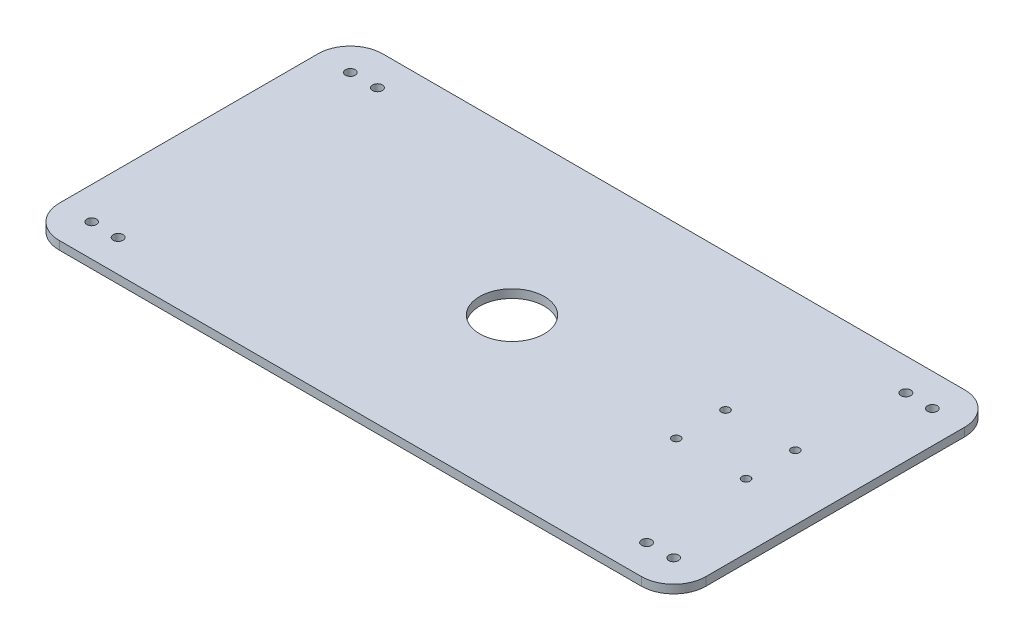
ISO-10303-21;
HEADER;
FILE_DESCRIPTION(('STEP AP214'),'2;1');
FILE_NAME('part.step','',(''),(''),'','','');
FILE_SCHEMA(('AUTOMOTIVE_DESIGN { 1 0 10303 214 1 1 1 1 }'));
ENDSEC;
DATA;
#1=APPLICATION_CONTEXT('core data for automotive mechanical design processes');
#2=APPLICATION_PROTOCOL_DEFINITION('international standard','automotive_design',2000,#1);
#3=PRODUCT_CONTEXT('',#1,'mechanical');
#4=PRODUCT('Part','Part','',(#3));
#5=PRODUCT_RELATED_PRODUCT_CATEGORY('part','',(#4));
#6=PRODUCT_DEFINITION_FORMATION('','',#4);
#7=PRODUCT_DEFINITION_CONTEXT('part definition',#1,'design');
#8=PRODUCT_DEFINITION('design','',#6,#7);
#9=PRODUCT_DEFINITION_SHAPE('','',#8);
#10=(LENGTH_UNIT() NAMED_UNIT(*) SI_UNIT(.MILLI.,.METRE.));
#11=(NAMED_UNIT(*) PLANE_ANGLE_UNIT() SI_UNIT($,.RADIAN.));
#12=(NAMED_UNIT(*) SI_UNIT($,.STERADIAN.) SOLID_ANGLE_UNIT());
#13=UNCERTAINTY_MEASURE_WITH_UNIT(LENGTH_MEASURE(1.E-05),#10,'distance_accuracy_value','');
#14=(GEOMETRIC_REPRESENTATION_CONTEXT(3) GLOBAL_UNCERTAINTY_ASSIGNED_CONTEXT((#13)) GLOBAL_UNIT_ASSIGNED_CONTEXT((#10,
#11,#12)) REPRESENTATION_CONTEXT('',''));
#15=CARTESIAN_POINT('',(0.,0.,0.));
#16=DIRECTION('',(0.,0.,1.));
#17=DIRECTION('',(1.,0.,0.));
#18=AXIS2_PLACEMENT_3D('',#15,#16,#17);
#19=CARTESIAN_POINT('',(0.,2.6,0.));
#20=DIRECTION('',(1.,0.,0.));
#21=DIRECTION('',(0.,0.,-1.));
#22=AXIS2_PLACEMENT_3D('',#19,#20,#21);
#23=PLANE('',#22);
#24=DIRECTION('',(0.,0.,1.));
#25=VECTOR('',#24,1.);
#26=CARTESIAN_POINT('',(0.,2.6,0.));
#27=LINE('',#26,#25);
#28=CARTESIAN_POINT('',(0.,2.6,10.));
#29=VERTEX_POINT('',#28);
#30=CARTESIAN_POINT('',(0.,2.6,90.));
#31=VERTEX_POINT('',#30);
#32=EDGE_CURVE('E120',#29,#31,#27,.T.);
#33=ORIENTED_EDGE('',*,*,#32,.F.);
#34=DIRECTION('',(0.,-1.,0.));
#35=VECTOR('',#34,1.);
#36=CARTESIAN_POINT('',(0.,0.,10.));
#37=LINE('',#36,#35);
#38=CARTESIAN_POINT('',(0.,0.,10.));
#39=VERTEX_POINT('',#38);
#40=EDGE_CURVE('E105',#29,#39,#37,.T.);
#41=ORIENTED_EDGE('',*,*,#40,.T.);
#42=DIRECTION('',(0.,0.,1.));
#43=VECTOR('',#42,1.);
#44=CARTESIAN_POINT('',(0.,0.,0.));
#45=LINE('',#44,#43);
#46=CARTESIAN_POINT('',(0.,0.,90.));
#47=VERTEX_POINT('',#46);
#48=EDGE_CURVE('E117',#39,#47,#45,.T.);
#49=ORIENTED_EDGE('',*,*,#48,.T.);
#50=DIRECTION('',(0.,-1.,0.));
#51=VECTOR('',#50,1.);
#52=CARTESIAN_POINT('',(0.,2.6,90.));
#53=LINE('',#52,#51);
#54=EDGE_CURVE('E122',#47,#31,#53,.F.);
#55=ORIENTED_EDGE('',*,*,#54,.T.);
#56=EDGE_LOOP('',(#33,#41,#49,#55));
#57=FACE_BOUND('',#56,.T.);
#58=ADVANCED_FACE('F35',(#57),#23,.F.);
#59=CARTESIAN_POINT('',(0.,2.6,100.));
#60=DIRECTION('',(0.,0.,-1.));
#61=DIRECTION('',(-1.,0.,0.));
#62=AXIS2_PLACEMENT_3D('',#59,#60,#61);
#63=PLANE('',#62);
#64=DIRECTION('',(1.,0.,0.));
#65=VECTOR('',#64,1.);
#66=CARTESIAN_POINT('',(0.,2.6,100.));
#67=LINE('',#66,#65);
#68=CARTESIAN_POINT('',(10.,2.6,100.));
#69=VERTEX_POINT('',#68);
#70=CARTESIAN_POINT('',(190.,2.6,100.));
#71=VERTEX_POINT('',#70);
#72=EDGE_CURVE('E167',#69,#71,#67,.T.);
#73=ORIENTED_EDGE('',*,*,#72,.F.);
#74=DIRECTION('',(0.,-1.,0.));
#75=VECTOR('',#74,1.);
#76=CARTESIAN_POINT('',(10.,2.6,100.));
#77=LINE('',#76,#75);
#78=CARTESIAN_POINT('',(10.,0.,100.));
#79=VERTEX_POINT('',#78);
#80=EDGE_CURVE('E160',#69,#79,#77,.T.);
#81=ORIENTED_EDGE('',*,*,#80,.T.);
#82=DIRECTION('',(1.,0.,0.));
#83=VECTOR('',#82,1.);
#84=CARTESIAN_POINT('',(0.,0.,100.));
#85=LINE('',#84,#83);
#86=CARTESIAN_POINT('',(190.,0.,100.));
#87=VERTEX_POINT('',#86);
#88=EDGE_CURVE('E126',#79,#87,#85,.T.);
#89=ORIENTED_EDGE('',*,*,#88,.T.);
#90=DIRECTION('',(0.,-1.,0.));
#91=VECTOR('',#90,1.);
#92=CARTESIAN_POINT('',(190.,2.6,100.));
#93=LINE('',#92,#91);
#94=EDGE_CURVE('E158',#87,#71,#93,.F.);
#95=ORIENTED_EDGE('',*,*,#94,.T.);
#96=EDGE_LOOP('',(#73,#81,#89,#95));
#97=FACE_BOUND('',#96,.T.);
#98=ADVANCED_FACE('F165',(#97),#63,.F.);
#99=CARTESIAN_POINT('',(200.,2.6,0.));
#100=DIRECTION('',(1.,0.,0.));
#101=DIRECTION('',(0.,0.,-1.));
#102=AXIS2_PLACEMENT_3D('',#99,#100,#101);
#103=PLANE('',#102);
#104=DIRECTION('',(0.,0.,1.));
#105=VECTOR('',#104,1.);
#106=CARTESIAN_POINT('',(200.,2.6,0.));
#107=LINE('',#106,#105);
#108=CARTESIAN_POINT('',(200.,2.6,10.));
#109=VERTEX_POINT('',#108);
#110=CARTESIAN_POINT('',(200.,2.6,90.));
#111=VERTEX_POINT('',#110);
#112=EDGE_CURVE('E174',#109,#111,#107,.T.);
#113=ORIENTED_EDGE('',*,*,#112,.T.);
#114=DIRECTION('',(0.,-1.,0.));
#115=VECTOR('',#114,1.);
#116=CARTESIAN_POINT('',(200.,0.,90.));
#117=LINE('',#116,#115);
#118=CARTESIAN_POINT('',(200.,0.,90.));
#119=VERTEX_POINT('',#118);
#120=EDGE_CURVE('E11',#111,#119,#117,.T.);
#121=ORIENTED_EDGE('',*,*,#120,.T.);
#122=DIRECTION('',(0.,0.,1.));
#123=VECTOR('',#122,1.);
#124=CARTESIAN_POINT('',(200.,0.,0.));
#125=LINE('',#124,#123);
#126=CARTESIAN_POINT('',(200.,0.,10.));
#127=VERTEX_POINT('',#126);
#128=EDGE_CURVE('E130',#127,#119,#125,.T.);
#129=ORIENTED_EDGE('',*,*,#128,.F.);
#130=DIRECTION('',(0.,-1.,0.));
#131=VECTOR('',#130,1.);
#132=CARTESIAN_POINT('',(200.,2.6,10.));
#133=LINE('',#132,#131);
#134=EDGE_CURVE('E43',#127,#109,#133,.F.);
#135=ORIENTED_EDGE('',*,*,#134,.T.);
#136=EDGE_LOOP('',(#113,#121,#129,#135));
#137=FACE_BOUND('',#136,.T.);
#138=ADVANCED_FACE('F173',(#137),#103,.T.);
#139=CARTESIAN_POINT('',(0.,2.6,0.));
#140=DIRECTION('',(0.,0.,-1.));
#141=DIRECTION('',(-1.,0.,0.));
#142=AXIS2_PLACEMENT_3D('',#139,#140,#141);
#143=PLANE('',#142);
#144=DIRECTION('',(1.,0.,0.));
#145=VECTOR('',#144,1.);
#146=CARTESIAN_POINT('',(0.,0.,0.));
#147=LINE('',#146,#145);
#148=CARTESIAN_POINT('',(10.,0.,0.));
#149=VERTEX_POINT('',#148);
#150=CARTESIAN_POINT('',(190.,0.,0.));
#151=VERTEX_POINT('',#150);
#152=EDGE_CURVE('E141',#149,#151,#147,.T.);
#153=ORIENTED_EDGE('',*,*,#152,.F.);
#154=DIRECTION('',(0.,-1.,0.));
#155=VECTOR('',#154,1.);
#156=CARTESIAN_POINT('',(10.,2.6,0.));
#157=LINE('',#156,#155);
#158=CARTESIAN_POINT('',(10.,2.6,0.));
#159=VERTEX_POINT('',#158);
#160=EDGE_CURVE('E106',#149,#159,#157,.F.);
#161=ORIENTED_EDGE('',*,*,#160,.T.);
#162=DIRECTION('',(1.,0.,0.));
#163=VECTOR('',#162,1.);
#164=CARTESIAN_POINT('',(0.,2.6,0.));
#165=LINE('',#164,#163);
#166=CARTESIAN_POINT('',(190.,2.6,0.));
#167=VERTEX_POINT('',#166);
#168=EDGE_CURVE('E136',#159,#167,#165,.T.);
#169=ORIENTED_EDGE('',*,*,#168,.T.);
#170=DIRECTION('',(0.,-1.,0.));
#171=VECTOR('',#170,1.);
#172=CARTESIAN_POINT('',(190.,2.6,0.));
#173=LINE('',#172,#171);
#174=EDGE_CURVE('E111',#167,#151,#173,.T.);
#175=ORIENTED_EDGE('',*,*,#174,.T.);
#176=EDGE_LOOP('',(#153,#161,#169,#175));
#177=FACE_BOUND('',#176,.T.);
#178=ADVANCED_FACE('F431',(#177),#143,.T.);
#179=CARTESIAN_POINT('',(0.,2.6,0.));
#180=DIRECTION('',(0.,1.,0.));
#181=DIRECTION('',(0.,0.,1.));
#182=AXIS2_PLACEMENT_3D('',#179,#180,#181);
#183=PLANE('',#182);
#184=CARTESIAN_POINT('',(18.288,2.6,90.094));
#185=DIRECTION('',(0.,-1.,0.));
#186=DIRECTION('',(0.,0.,-1.));
#187=AXIS2_PLACEMENT_3D('',#184,#185,#186);
#188=CIRCLE('',#187,1.524);
#189=CARTESIAN_POINT('',(18.288,2.6,88.57));
#190=VERTEX_POINT('',#189);
#191=EDGE_CURVE('E249',#190,#190,#188,.T.);
#192=ORIENTED_EDGE('',*,*,#191,.T.);
#193=EDGE_LOOP('',(#192));
#194=FACE_BOUND('',#193,.T.);
#195=CARTESIAN_POINT('',(181.712,2.6,90.094));
#196=DIRECTION('',(0.,1.,0.));
#197=DIRECTION('',(0.,0.,-1.));
#198=AXIS2_PLACEMENT_3D('',#195,#196,#197);
#199=CIRCLE('',#198,1.524);
#200=CARTESIAN_POINT('',(181.712,2.6,88.57));
#201=VERTEX_POINT('',#200);
#202=EDGE_CURVE('E243',#201,#201,#199,.T.);
#203=ORIENTED_EDGE('',*,*,#202,.F.);
#204=EDGE_LOOP('',(#203));
#205=FACE_BOUND('',#204,.T.);
#206=CARTESIAN_POINT('',(181.712,2.6,9.90599999999999));
#207=DIRECTION('',(0.,-1.,0.));
#208=DIRECTION('',(0.,0.,1.));
#209=AXIS2_PLACEMENT_3D('',#206,#207,#208);
#210=CIRCLE('',#209,1.524);
#211=CARTESIAN_POINT('',(181.712,2.6,11.43));
#212=VERTEX_POINT('',#211);
#213=EDGE_CURVE('E237',#212,#212,#210,.T.);
#214=ORIENTED_EDGE('',*,*,#213,.T.);
#215=EDGE_LOOP('',(#214));
#216=FACE_BOUND('',#215,.T.);
#217=CARTESIAN_POINT('',(18.288,2.6,9.906));
#218=DIRECTION('',(0.,1.,0.));
#219=DIRECTION('',(0.,0.,1.));
#220=AXIS2_PLACEMENT_3D('',#217,#218,#219);
#221=CIRCLE('',#220,1.524);
#222=CARTESIAN_POINT('',(18.288,2.6,11.43));
#223=VERTEX_POINT('',#222);
#224=EDGE_CURVE('E231',#223,#223,#221,.T.);
#225=ORIENTED_EDGE('',*,*,#224,.F.);
#226=EDGE_LOOP('',(#225));
#227=FACE_BOUND('',#226,.T.);
#228=CARTESIAN_POINT('',(180.,2.6,42.38));
#229=DIRECTION('',(0.,1.,0.));
#230=DIRECTION('',(0.,0.,1.));
#231=AXIS2_PLACEMENT_3D('',#228,#229,#230);
#232=CIRCLE('',#231,1.27);
#233=CARTESIAN_POINT('',(180.,2.6,43.65));
#234=VERTEX_POINT('',#233);
#235=EDGE_CURVE('E226',#234,#234,#232,.T.);
#236=ORIENTED_EDGE('',*,*,#235,.F.);
#237=EDGE_LOOP('',(#236));
#238=FACE_BOUND('',#237,.T.);
#239=CARTESIAN_POINT('',(158.41,2.6,57.62));
#240=DIRECTION('',(0.,1.,0.));
#241=DIRECTION('',(0.,0.,1.));
#242=AXIS2_PLACEMENT_3D('',#239,#240,#241);
#243=CIRCLE('',#242,1.27);
#244=CARTESIAN_POINT('',(158.41,2.6,58.89));
#245=VERTEX_POINT('',#244);
#246=EDGE_CURVE('E220',#245,#245,#243,.T.);
#247=ORIENTED_EDGE('',*,*,#246,.F.);
#248=EDGE_LOOP('',(#247));
#249=FACE_BOUND('',#248,.T.);
#250=CARTESIAN_POINT('',(180.,2.6,57.62));
#251=DIRECTION('',(0.,1.,0.));
#252=DIRECTION('',(0.,0.,1.));
#253=AXIS2_PLACEMENT_3D('',#250,#251,#252);
#254=CIRCLE('',#253,1.27);
#255=CARTESIAN_POINT('',(180.,2.6,58.89));
#256=VERTEX_POINT('',#255);
#257=EDGE_CURVE('E213',#256,#256,#254,.T.);
#258=ORIENTED_EDGE('',*,*,#257,.F.);
#259=EDGE_LOOP('',(#258));
#260=FACE_BOUND('',#259,.T.);
#261=CARTESIAN_POINT('',(158.41,2.6,42.38));
#262=DIRECTION('',(0.,1.,0.));
#263=DIRECTION('',(0.,0.,1.));
#264=AXIS2_PLACEMENT_3D('',#261,#262,#263);
#265=CIRCLE('',#264,1.27);
#266=CARTESIAN_POINT('',(158.41,2.6,43.65));
#267=VERTEX_POINT('',#266);
#268=EDGE_CURVE('E207',#267,#267,#265,.T.);
#269=ORIENTED_EDGE('',*,*,#268,.F.);
#270=EDGE_LOOP('',(#269));
#271=FACE_BOUND('',#270,.T.);
#272=CARTESIAN_POINT('',(100.,2.6,50.));
#273=DIRECTION('',(0.,-1.,0.));
#274=DIRECTION('',(0.,0.,-1.));
#275=AXIS2_PLACEMENT_3D('',#272,#273,#274);
#276=CIRCLE('',#275,9.99999999999999);
#277=CARTESIAN_POINT('',(100.,2.6,40.));
#278=VERTEX_POINT('',#277);
#279=EDGE_CURVE('E198',#278,#278,#276,.T.);
#280=ORIENTED_EDGE('',*,*,#279,.T.);
#281=EDGE_LOOP('',(#280));
#282=FACE_BOUND('',#281,.T.);
#283=CARTESIAN_POINT('',(190.,2.6,90.));
#284=DIRECTION('',(0.,1.,0.));
#285=DIRECTION('',(0.,0.,1.));
#286=AXIS2_PLACEMENT_3D('',#283,#284,#285);
#287=CIRCLE('',#286,1.5);
#288=CARTESIAN_POINT('',(190.,2.6,91.5));
#289=VERTEX_POINT('',#288);
#290=EDGE_CURVE('E192',#289,#289,#287,.T.);
#291=ORIENTED_EDGE('',*,*,#290,.F.);
#292=EDGE_LOOP('',(#291));
#293=FACE_BOUND('',#292,.T.);
#294=CARTESIAN_POINT('',(10.,2.6,90.));
#295=DIRECTION('',(0.,-1.,0.));
#296=DIRECTION('',(0.,0.,1.));
#297=AXIS2_PLACEMENT_3D('',#294,#295,#296);
#298=CIRCLE('',#297,1.5);
#299=CARTESIAN_POINT('',(10.,2.6,91.5));
#300=VERTEX_POINT('',#299);
#301=EDGE_CURVE('E186',#300,#300,#298,.T.);
#302=ORIENTED_EDGE('',*,*,#301,.T.);
#303=EDGE_LOOP('',(#302));
#304=FACE_BOUND('',#303,.T.);
#305=CARTESIAN_POINT('',(10.,2.6,10.));
#306=DIRECTION('',(0.,1.,0.));
#307=DIRECTION('',(0.,0.,-1.));
#308=AXIS2_PLACEMENT_3D('',#305,#306,#307);
#309=CIRCLE('',#308,1.5);
#310=CARTESIAN_POINT('',(10.,2.6,8.50000000000001));
#311=VERTEX_POINT('',#310);
#312=EDGE_CURVE('E181',#311,#311,#309,.T.);
#313=ORIENTED_EDGE('',*,*,#312,.F.);
#314=EDGE_LOOP('',(#313));
#315=FACE_BOUND('',#314,.T.);
#316=CARTESIAN_POINT('',(190.,2.6,10.));
#317=DIRECTION('',(0.,-1.,0.));
#318=DIRECTION('',(0.,0.,-1.));
#319=AXIS2_PLACEMENT_3D('',#316,#317,#318);
#320=CIRCLE('',#319,1.5);
#321=CARTESIAN_POINT('',(190.,2.6,8.5));
#322=VERTEX_POINT('',#321);
#323=EDGE_CURVE('E127',#322,#322,#320,.T.);
#324=ORIENTED_EDGE('',*,*,#323,.T.);
#325=EDGE_LOOP('',(#324));
#326=FACE_BOUND('',#325,.T.);
#327=ORIENTED_EDGE('',*,*,#168,.F.);
#328=CARTESIAN_POINT('',(10.,2.6,10.));
#329=DIRECTION('',(0.,1.,0.));
#330=DIRECTION('',(0.,0.,1.));
#331=AXIS2_PLACEMENT_3D('',#328,#329,#330);
#332=CIRCLE('',#331,10.);
#333=EDGE_CURVE('E156',#159,#29,#332,.T.);
#334=ORIENTED_EDGE('',*,*,#333,.T.);
#335=ORIENTED_EDGE('',*,*,#32,.T.);
#336=CARTESIAN_POINT('',(10.,2.6,90.));
#337=DIRECTION('',(0.,1.,0.));
#338=DIRECTION('',(0.,0.,1.));
#339=AXIS2_PLACEMENT_3D('',#336,#337,#338);
#340=CIRCLE('',#339,10.);
#341=EDGE_CURVE('E154',#31,#69,#340,.T.);
#342=ORIENTED_EDGE('',*,*,#341,.T.);
#343=ORIENTED_EDGE('',*,*,#72,.T.);
#344=CARTESIAN_POINT('',(190.,2.6,90.));
#345=DIRECTION('',(0.,1.,0.));
#346=DIRECTION('',(0.,0.,1.));
#347=AXIS2_PLACEMENT_3D('',#344,#345,#346);
#348=CIRCLE('',#347,10.);
#349=EDGE_CURVE('E50',#71,#111,#348,.T.);
#350=ORIENTED_EDGE('',*,*,#349,.T.);
#351=ORIENTED_EDGE('',*,*,#112,.F.);
#352=CARTESIAN_POINT('',(190.,2.6,10.));
#353=DIRECTION('',(0.,1.,0.));
#354=DIRECTION('',(0.,0.,1.));
#355=AXIS2_PLACEMENT_3D('',#352,#353,#354);
#356=CIRCLE('',#355,10.);
#357=EDGE_CURVE('E151',#109,#167,#356,.T.);
#358=ORIENTED_EDGE('',*,*,#357,.T.);
#359=EDGE_LOOP('',(#327,#334,#335,#342,#343,#350,#351,#358));
#360=FACE_BOUND('',#359,.T.);
#361=ADVANCED_FACE('F260',(#194,#205,#216,#227,#238,#249,#260,#271,#282,#293,#304,#315,#326,
#360),#183,.T.);
#362=CARTESIAN_POINT('',(0.,0.,0.));
#363=DIRECTION('',(0.,1.,0.));
#364=DIRECTION('',(0.,0.,1.));
#365=AXIS2_PLACEMENT_3D('',#362,#363,#364);
#366=PLANE('',#365);
#367=CARTESIAN_POINT('',(18.288,1.19999999954185E-07,90.094));
#368=DIRECTION('',(0.,-1.,0.));
#369=DIRECTION('',(0.,0.,-1.));
#370=AXIS2_PLACEMENT_3D('',#367,#368,#369);
#371=CIRCLE('',#370,1.524);
#372=CARTESIAN_POINT('',(18.288,1.19999999954185E-07,88.57));
#373=VERTEX_POINT('',#372);
#374=EDGE_CURVE('E246',#373,#373,#371,.T.);
#375=ORIENTED_EDGE('',*,*,#374,.F.);
#376=EDGE_LOOP('',(#375));
#377=FACE_BOUND('',#376,.T.);
#378=CARTESIAN_POINT('',(181.712,1.19999999954185E-07,90.094));
#379=DIRECTION('',(0.,1.,0.));
#380=DIRECTION('',(0.,0.,-1.));
#381=AXIS2_PLACEMENT_3D('',#378,#379,#380);
#382=CIRCLE('',#381,1.524);
#383=CARTESIAN_POINT('',(181.712,1.19999999954185E-07,88.57));
#384=VERTEX_POINT('',#383);
#385=EDGE_CURVE('E240',#384,#384,#382,.T.);
#386=ORIENTED_EDGE('',*,*,#385,.T.);
#387=EDGE_LOOP('',(#386));
#388=FACE_BOUND('',#387,.T.);
#389=CARTESIAN_POINT('',(181.712,1.19999999954185E-07,9.90599999999999));
#390=DIRECTION('',(0.,-1.,0.));
#391=DIRECTION('',(0.,0.,1.));
#392=AXIS2_PLACEMENT_3D('',#389,#390,#391);
#393=CIRCLE('',#392,1.524);
#394=CARTESIAN_POINT('',(181.712,1.19999999954185E-07,11.43));
#395=VERTEX_POINT('',#394);
#396=EDGE_CURVE('E234',#395,#395,#393,.T.);
#397=ORIENTED_EDGE('',*,*,#396,.F.);
#398=EDGE_LOOP('',(#397));
#399=FACE_BOUND('',#398,.T.);
#400=CARTESIAN_POINT('',(18.288,1.19999999954185E-07,9.906));
#401=DIRECTION('',(0.,1.,0.));
#402=DIRECTION('',(0.,0.,1.));
#403=AXIS2_PLACEMENT_3D('',#400,#401,#402);
#404=CIRCLE('',#403,1.524);
#405=CARTESIAN_POINT('',(18.288,1.19999999954185E-07,11.43));
#406=VERTEX_POINT('',#405);
#407=EDGE_CURVE('E217',#406,#406,#404,.T.);
#408=ORIENTED_EDGE('',*,*,#407,.T.);
#409=EDGE_LOOP('',(#408));
#410=FACE_BOUND('',#409,.T.);
#411=CARTESIAN_POINT('',(180.,0.,42.38));
#412=DIRECTION('',(0.,1.,0.));
#413=DIRECTION('',(0.,0.,1.));
#414=AXIS2_PLACEMENT_3D('',#411,#412,#413);
#415=CIRCLE('',#414,1.27);
#416=CARTESIAN_POINT('',(180.,0.,43.65));
#417=VERTEX_POINT('',#416);
#418=EDGE_CURVE('E210',#417,#417,#415,.T.);
#419=ORIENTED_EDGE('',*,*,#418,.T.);
#420=EDGE_LOOP('',(#419));
#421=FACE_BOUND('',#420,.T.);
#422=CARTESIAN_POINT('',(158.41,0.,57.62));
#423=DIRECTION('',(0.,1.,0.));
#424=DIRECTION('',(0.,0.,1.));
#425=AXIS2_PLACEMENT_3D('',#422,#423,#424);
#426=CIRCLE('',#425,1.27);
#427=CARTESIAN_POINT('',(158.41,0.,58.89));
#428=VERTEX_POINT('',#427);
#429=EDGE_CURVE('E223',#428,#428,#426,.T.);
#430=ORIENTED_EDGE('',*,*,#429,.T.);
#431=EDGE_LOOP('',(#430));
#432=FACE_BOUND('',#431,.T.);
#433=CARTESIAN_POINT('',(180.,0.,57.62));
#434=DIRECTION('',(0.,1.,0.));
#435=DIRECTION('',(0.,0.,1.));
#436=AXIS2_PLACEMENT_3D('',#433,#434,#435);
#437=CIRCLE('',#436,1.27);
#438=CARTESIAN_POINT('',(180.,0.,58.89));
#439=VERTEX_POINT('',#438);
#440=EDGE_CURVE('E216',#439,#439,#437,.T.);
#441=ORIENTED_EDGE('',*,*,#440,.T.);
#442=EDGE_LOOP('',(#441));
#443=FACE_BOUND('',#442,.T.);
#444=CARTESIAN_POINT('',(158.41,0.,42.38));
#445=DIRECTION('',(0.,1.,0.));
#446=DIRECTION('',(0.,0.,1.));
#447=AXIS2_PLACEMENT_3D('',#444,#445,#446);
#448=CIRCLE('',#447,1.27);
#449=CARTESIAN_POINT('',(158.41,0.,43.65));
#450=VERTEX_POINT('',#449);
#451=EDGE_CURVE('E204',#450,#450,#448,.T.);
#452=ORIENTED_EDGE('',*,*,#451,.T.);
#453=EDGE_LOOP('',(#452));
#454=FACE_BOUND('',#453,.T.);
#455=CARTESIAN_POINT('',(100.,0.,50.));
#456=DIRECTION('',(0.,-1.,0.));
#457=DIRECTION('',(0.,0.,-1.));
#458=AXIS2_PLACEMENT_3D('',#455,#456,#457);
#459=CIRCLE('',#458,9.99999999999999);
#460=CARTESIAN_POINT('',(100.,0.,40.));
#461=VERTEX_POINT('',#460);
#462=EDGE_CURVE('E201',#461,#461,#459,.T.);
#463=ORIENTED_EDGE('',*,*,#462,.F.);
#464=EDGE_LOOP('',(#463));
#465=FACE_BOUND('',#464,.T.);
#466=CARTESIAN_POINT('',(190.,0.,90.));
#467=DIRECTION('',(0.,1.,0.));
#468=DIRECTION('',(0.,0.,1.));
#469=AXIS2_PLACEMENT_3D('',#466,#467,#468);
#470=CIRCLE('',#469,1.5);
#471=CARTESIAN_POINT('',(190.,0.,91.5));
#472=VERTEX_POINT('',#471);
#473=EDGE_CURVE('E195',#472,#472,#470,.T.);
#474=ORIENTED_EDGE('',*,*,#473,.T.);
#475=EDGE_LOOP('',(#474));
#476=FACE_BOUND('',#475,.T.);
#477=CARTESIAN_POINT('',(10.,0.,90.));
#478=DIRECTION('',(0.,-1.,0.));
#479=DIRECTION('',(0.,0.,1.));
#480=AXIS2_PLACEMENT_3D('',#477,#478,#479);
#481=CIRCLE('',#480,1.5);
#482=CARTESIAN_POINT('',(10.,0.,91.5));
#483=VERTEX_POINT('',#482);
#484=EDGE_CURVE('E189',#483,#483,#481,.T.);
#485=ORIENTED_EDGE('',*,*,#484,.F.);
#486=EDGE_LOOP('',(#485));
#487=FACE_BOUND('',#486,.T.);
#488=CARTESIAN_POINT('',(10.,0.,10.));
#489=DIRECTION('',(0.,1.,0.));
#490=DIRECTION('',(0.,0.,-1.));
#491=AXIS2_PLACEMENT_3D('',#488,#489,#490);
#492=CIRCLE('',#491,1.5);
#493=CARTESIAN_POINT('',(10.,0.,8.50000000000001));
#494=VERTEX_POINT('',#493);
#495=EDGE_CURVE('E183',#494,#494,#492,.T.);
#496=ORIENTED_EDGE('',*,*,#495,.T.);
#497=EDGE_LOOP('',(#496));
#498=FACE_BOUND('',#497,.T.);
#499=CARTESIAN_POINT('',(190.,0.,10.));
#500=DIRECTION('',(0.,-1.,0.));
#501=DIRECTION('',(0.,0.,-1.));
#502=AXIS2_PLACEMENT_3D('',#499,#500,#501);
#503=CIRCLE('',#502,1.5);
#504=CARTESIAN_POINT('',(190.,0.,8.5));
#505=VERTEX_POINT('',#504);
#506=EDGE_CURVE('E133',#505,#505,#503,.T.);
#507=ORIENTED_EDGE('',*,*,#506,.F.);
#508=EDGE_LOOP('',(#507));
#509=FACE_BOUND('',#508,.T.);
#510=ORIENTED_EDGE('',*,*,#48,.F.);
#511=CARTESIAN_POINT('',(10.,0.,10.));
#512=DIRECTION('',(0.,1.,0.));
#513=DIRECTION('',(0.,0.,1.));
#514=AXIS2_PLACEMENT_3D('',#511,#512,#513);
#515=CIRCLE('',#514,10.);
#516=EDGE_CURVE('E101',#39,#149,#515,.F.);
#517=ORIENTED_EDGE('',*,*,#516,.T.);
#518=ORIENTED_EDGE('',*,*,#152,.T.);
#519=CARTESIAN_POINT('',(190.,0.,10.));
#520=DIRECTION('',(0.,1.,0.));
#521=DIRECTION('',(0.,0.,1.));
#522=AXIS2_PLACEMENT_3D('',#519,#520,#521);
#523=CIRCLE('',#522,10.);
#524=EDGE_CURVE('E121',#151,#127,#523,.F.);
#525=ORIENTED_EDGE('',*,*,#524,.T.);
#526=ORIENTED_EDGE('',*,*,#128,.T.);
#527=CARTESIAN_POINT('',(190.,0.,90.));
#528=DIRECTION('',(0.,1.,0.));
#529=DIRECTION('',(0.,0.,1.));
#530=AXIS2_PLACEMENT_3D('',#527,#528,#529);
#531=CIRCLE('',#530,10.);
#532=EDGE_CURVE('E145',#119,#87,#531,.F.);
#533=ORIENTED_EDGE('',*,*,#532,.T.);
#534=ORIENTED_EDGE('',*,*,#88,.F.);
#535=CARTESIAN_POINT('',(10.,0.,90.));
#536=DIRECTION('',(0.,1.,0.));
#537=DIRECTION('',(0.,0.,1.));
#538=AXIS2_PLACEMENT_3D('',#535,#536,#537);
#539=CIRCLE('',#538,10.);
#540=EDGE_CURVE('E112',#79,#47,#539,.F.);
#541=ORIENTED_EDGE('',*,*,#540,.T.);
#542=EDGE_LOOP('',(#510,#517,#518,#525,#526,#533,#534,#541));
#543=FACE_BOUND('',#542,.T.);
#544=ADVANCED_FACE('F124',(#377,#388,#399,#410,#421,#432,#443,#454,#465,#476,#487,#498,#509,
#543),#366,.F.);
#545=CARTESIAN_POINT('',(10.,2.6,10.));
#546=DIRECTION('',(0.,1.,0.));
#547=DIRECTION('',(0.,0.,1.));
#548=AXIS2_PLACEMENT_3D('',#545,#546,#547);
#549=CYLINDRICAL_SURFACE('',#548,10.);
#550=ORIENTED_EDGE('',*,*,#333,.F.);
#551=ORIENTED_EDGE('',*,*,#160,.F.);
#552=ORIENTED_EDGE('',*,*,#516,.F.);
#553=ORIENTED_EDGE('',*,*,#40,.F.);
#554=EDGE_LOOP('',(#550,#551,#552,#553));
#555=FACE_BOUND('',#554,.T.);
#556=ADVANCED_FACE('F104',(#555),#549,.T.);
#557=CARTESIAN_POINT('',(10.,2.6,90.));
#558=DIRECTION('',(0.,-1.,0.));
#559=DIRECTION('',(0.,0.,-1.));
#560=AXIS2_PLACEMENT_3D('',#557,#558,#559);
#561=CYLINDRICAL_SURFACE('',#560,10.);
#562=ORIENTED_EDGE('',*,*,#341,.F.);
#563=ORIENTED_EDGE('',*,*,#54,.F.);
#564=ORIENTED_EDGE('',*,*,#540,.F.);
#565=ORIENTED_EDGE('',*,*,#80,.F.);
#566=EDGE_LOOP('',(#562,#563,#564,#565));
#567=FACE_BOUND('',#566,.T.);
#568=ADVANCED_FACE('F311',(#567),#561,.T.);
#569=CARTESIAN_POINT('',(190.,2.6,90.));
#570=DIRECTION('',(0.,1.,0.));
#571=DIRECTION('',(0.,0.,1.));
#572=AXIS2_PLACEMENT_3D('',#569,#570,#571);
#573=CYLINDRICAL_SURFACE('',#572,10.);
#574=ORIENTED_EDGE('',*,*,#349,.F.);
#575=ORIENTED_EDGE('',*,*,#94,.F.);
#576=ORIENTED_EDGE('',*,*,#532,.F.);
#577=ORIENTED_EDGE('',*,*,#120,.F.);
#578=EDGE_LOOP('',(#574,#575,#576,#577));
#579=FACE_BOUND('',#578,.T.);
#580=ADVANCED_FACE('F172',(#579),#573,.T.);
#581=CARTESIAN_POINT('',(190.,2.6,10.));
#582=DIRECTION('',(0.,-1.,0.));
#583=DIRECTION('',(0.,0.,-1.));
#584=AXIS2_PLACEMENT_3D('',#581,#582,#583);
#585=CYLINDRICAL_SURFACE('',#584,10.);
#586=ORIENTED_EDGE('',*,*,#357,.F.);
#587=ORIENTED_EDGE('',*,*,#134,.F.);
#588=ORIENTED_EDGE('',*,*,#524,.F.);
#589=ORIENTED_EDGE('',*,*,#174,.F.);
#590=EDGE_LOOP('',(#586,#587,#588,#589));
#591=FACE_BOUND('',#590,.T.);
#592=ADVANCED_FACE('F37',(#591),#585,.T.);
#593=CARTESIAN_POINT('',(190.,2.6,10.));
#594=DIRECTION('',(0.,-1.,0.));
#595=DIRECTION('',(0.,0.,-1.));
#596=AXIS2_PLACEMENT_3D('',#593,#594,#595);
#597=CYLINDRICAL_SURFACE('',#596,1.5);
#598=ORIENTED_EDGE('',*,*,#323,.F.);
#599=EDGE_LOOP('',(#598));
#600=FACE_BOUND('',#599,.T.);
#601=ORIENTED_EDGE('',*,*,#506,.T.);
#602=EDGE_LOOP('',(#601));
#603=FACE_BOUND('',#602,.T.);
#604=ADVANCED_FACE('F286',(#600,#603),#597,.F.);
#605=CARTESIAN_POINT('',(10.,2.6,10.));
#606=DIRECTION('',(0.,-1.,0.));
#607=DIRECTION('',(0.,0.,-1.));
#608=AXIS2_PLACEMENT_3D('',#605,#606,#607);
#609=CYLINDRICAL_SURFACE('',#608,1.5);
#610=ORIENTED_EDGE('',*,*,#312,.T.);
#611=EDGE_LOOP('',(#610));
#612=FACE_BOUND('',#611,.T.);
#613=ORIENTED_EDGE('',*,*,#495,.F.);
#614=EDGE_LOOP('',(#613));
#615=FACE_BOUND('',#614,.T.);
#616=ADVANCED_FACE('F288',(#612,#615),#609,.F.);
#617=CARTESIAN_POINT('',(10.,2.6,90.));
#618=DIRECTION('',(0.,-1.,0.));
#619=DIRECTION('',(0.,0.,-1.));
#620=AXIS2_PLACEMENT_3D('',#617,#618,#619);
#621=CYLINDRICAL_SURFACE('',#620,1.5);
#622=ORIENTED_EDGE('',*,*,#301,.F.);
#623=EDGE_LOOP('',(#622));
#624=FACE_BOUND('',#623,.T.);
#625=ORIENTED_EDGE('',*,*,#484,.T.);
#626=EDGE_LOOP('',(#625));
#627=FACE_BOUND('',#626,.T.);
#628=ADVANCED_FACE('F295',(#624,#627),#621,.F.);
#629=CARTESIAN_POINT('',(190.,2.6,90.));
#630=DIRECTION('',(0.,-1.,0.));
#631=DIRECTION('',(0.,0.,-1.));
#632=AXIS2_PLACEMENT_3D('',#629,#630,#631);
#633=CYLINDRICAL_SURFACE('',#632,1.5);
#634=ORIENTED_EDGE('',*,*,#290,.T.);
#635=EDGE_LOOP('',(#634));
#636=FACE_BOUND('',#635,.T.);
#637=ORIENTED_EDGE('',*,*,#473,.F.);
#638=EDGE_LOOP('',(#637));
#639=FACE_BOUND('',#638,.T.);
#640=ADVANCED_FACE('F341',(#636,#639),#633,.F.);
#641=CARTESIAN_POINT('',(100.,2.6,50.));
#642=DIRECTION('',(0.,-1.,0.));
#643=DIRECTION('',(0.,0.,-1.));
#644=AXIS2_PLACEMENT_3D('',#641,#642,#643);
#645=CYLINDRICAL_SURFACE('',#644,9.99999999999999);
#646=ORIENTED_EDGE('',*,*,#279,.F.);
#647=EDGE_LOOP('',(#646));
#648=FACE_BOUND('',#647,.T.);
#649=ORIENTED_EDGE('',*,*,#462,.T.);
#650=EDGE_LOOP('',(#649));
#651=FACE_BOUND('',#650,.T.);
#652=ADVANCED_FACE('F351',(#648,#651),#645,.F.);
#653=CARTESIAN_POINT('',(158.41,0.,42.38));
#654=DIRECTION('',(0.,1.,0.));
#655=DIRECTION('',(0.,0.,1.));
#656=AXIS2_PLACEMENT_3D('',#653,#654,#655);
#657=CYLINDRICAL_SURFACE('',#656,1.27);
#658=ORIENTED_EDGE('',*,*,#451,.F.);
#659=EDGE_LOOP('',(#658));
#660=FACE_BOUND('',#659,.T.);
#661=ORIENTED_EDGE('',*,*,#268,.T.);
#662=EDGE_LOOP('',(#661));
#663=FACE_BOUND('',#662,.T.);
#664=ADVANCED_FACE('F361',(#660,#663),#657,.F.);
#665=CARTESIAN_POINT('',(180.,0.,57.62));
#666=DIRECTION('',(0.,1.,0.));
#667=DIRECTION('',(0.,0.,1.));
#668=AXIS2_PLACEMENT_3D('',#665,#666,#667);
#669=CYLINDRICAL_SURFACE('',#668,1.27);
#670=ORIENTED_EDGE('',*,*,#440,.F.);
#671=EDGE_LOOP('',(#670));
#672=FACE_BOUND('',#671,.T.);
#673=ORIENTED_EDGE('',*,*,#257,.T.);
#674=EDGE_LOOP('',(#673));
#675=FACE_BOUND('',#674,.T.);
#676=ADVANCED_FACE('F371',(#672,#675),#669,.F.);
#677=CARTESIAN_POINT('',(158.41,0.,57.62));
#678=DIRECTION('',(0.,1.,0.));
#679=DIRECTION('',(0.,0.,1.));
#680=AXIS2_PLACEMENT_3D('',#677,#678,#679);
#681=CYLINDRICAL_SURFACE('',#680,1.27);
#682=ORIENTED_EDGE('',*,*,#429,.F.);
#683=EDGE_LOOP('',(#682));
#684=FACE_BOUND('',#683,.T.);
#685=ORIENTED_EDGE('',*,*,#246,.T.);
#686=EDGE_LOOP('',(#685));
#687=FACE_BOUND('',#686,.T.);
#688=ADVANCED_FACE('F381',(#684,#687),#681,.F.);
#689=CARTESIAN_POINT('',(180.,0.,42.38));
#690=DIRECTION('',(0.,1.,0.));
#691=DIRECTION('',(0.,0.,1.));
#692=AXIS2_PLACEMENT_3D('',#689,#690,#691);
#693=CYLINDRICAL_SURFACE('',#692,1.27);
#694=ORIENTED_EDGE('',*,*,#418,.F.);
#695=EDGE_LOOP('',(#694));
#696=FACE_BOUND('',#695,.T.);
#697=ORIENTED_EDGE('',*,*,#235,.T.);
#698=EDGE_LOOP('',(#697));
#699=FACE_BOUND('',#698,.T.);
#700=ADVANCED_FACE('F391',(#696,#699),#693,.F.);
#701=CARTESIAN_POINT('',(18.288,1.19999999954185E-07,9.906));
#702=DIRECTION('',(0.,1.,0.));
#703=DIRECTION('',(0.,0.,1.));
#704=AXIS2_PLACEMENT_3D('',#701,#702,#703);
#705=CYLINDRICAL_SURFACE('',#704,1.524);
#706=ORIENTED_EDGE('',*,*,#407,.F.);
#707=EDGE_LOOP('',(#706));
#708=FACE_BOUND('',#707,.T.);
#709=ORIENTED_EDGE('',*,*,#224,.T.);
#710=EDGE_LOOP('',(#709));
#711=FACE_BOUND('',#710,.T.);
#712=ADVANCED_FACE('F401',(#708,#711),#705,.F.);
#713=CARTESIAN_POINT('',(181.712,1.19999999954185E-07,9.90599999999999));
#714=DIRECTION('',(0.,1.,0.));
#715=DIRECTION('',(0.,0.,1.));
#716=AXIS2_PLACEMENT_3D('',#713,#714,#715);
#717=CYLINDRICAL_SURFACE('',#716,1.524);
#718=ORIENTED_EDGE('',*,*,#396,.T.);
#719=EDGE_LOOP('',(#718));
#720=FACE_BOUND('',#719,.T.);
#721=ORIENTED_EDGE('',*,*,#213,.F.);
#722=EDGE_LOOP('',(#721));
#723=FACE_BOUND('',#722,.T.);
#724=ADVANCED_FACE('F411',(#720,#723),#717,.F.);
#725=CARTESIAN_POINT('',(181.712,1.19999999954185E-07,90.094));
#726=DIRECTION('',(0.,1.,0.));
#727=DIRECTION('',(0.,0.,1.));
#728=AXIS2_PLACEMENT_3D('',#725,#726,#727);
#729=CYLINDRICAL_SURFACE('',#728,1.524);
#730=ORIENTED_EDGE('',*,*,#385,.F.);
#731=EDGE_LOOP('',(#730));
#732=FACE_BOUND('',#731,.T.);
#733=ORIENTED_EDGE('',*,*,#202,.T.);
#734=EDGE_LOOP('',(#733));
#735=FACE_BOUND('',#734,.T.);
#736=ADVANCED_FACE('F421',(#732,#735),#729,.F.);
#737=CARTESIAN_POINT('',(18.288,1.19999999954185E-07,90.094));
#738=DIRECTION('',(0.,1.,0.));
#739=DIRECTION('',(0.,0.,1.));
#740=AXIS2_PLACEMENT_3D('',#737,#738,#739);
#741=CYLINDRICAL_SURFACE('',#740,1.524);
#742=ORIENTED_EDGE('',*,*,#374,.T.);
#743=EDGE_LOOP('',(#742));
#744=FACE_BOUND('',#743,.T.);
#745=ORIENTED_EDGE('',*,*,#191,.F.);
#746=EDGE_LOOP('',(#745));
#747=FACE_BOUND('',#746,.T.);
#748=ADVANCED_FACE('F255',(#744,#747),#741,.F.);
#749=CLOSED_SHELL('',(#58,#98,#138,#178,#361,#544,#556,#568,#580,#592,#604,#616,#628,#640,#652,
#664,#676,#688,#700,#712,#724,#736,#748));
#750=MANIFOLD_SOLID_BREP('B2',#749);
#751=ADVANCED_BREP_SHAPE_REPRESENTATION('',(#18,#750),#14);
#752=SHAPE_DEFINITION_REPRESENTATION(#9,#751);
ENDSEC;
END-ISO-10303-21;
